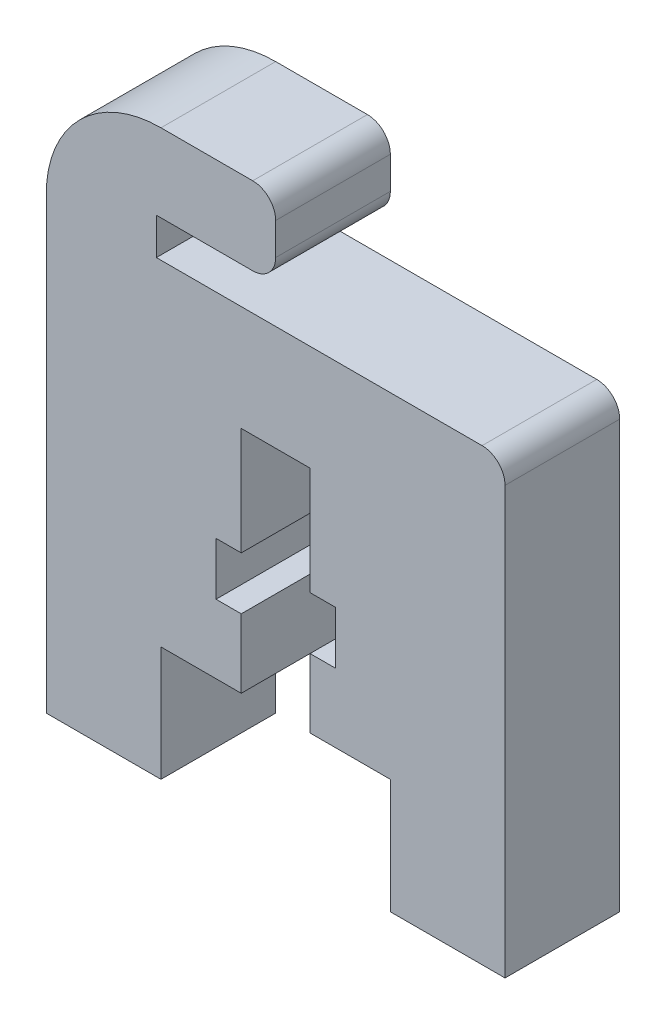
ISO-10303-21;
HEADER;
FILE_DESCRIPTION(('STEP AP214'),'2;1');
FILE_NAME('part.step','',(''),(''),'','','');
FILE_SCHEMA(('AUTOMOTIVE_DESIGN { 1 0 10303 214 1 1 1 1 }'));
ENDSEC;
DATA;
#1=APPLICATION_CONTEXT('core data for automotive mechanical design processes');
#2=APPLICATION_PROTOCOL_DEFINITION('international standard','automotive_design',2000,#1);
#3=PRODUCT_CONTEXT('',#1,'mechanical');
#4=PRODUCT('Part','Part','',(#3));
#5=PRODUCT_RELATED_PRODUCT_CATEGORY('part','',(#4));
#6=PRODUCT_DEFINITION_FORMATION('','',#4);
#7=PRODUCT_DEFINITION_CONTEXT('part definition',#1,'design');
#8=PRODUCT_DEFINITION('design','',#6,#7);
#9=PRODUCT_DEFINITION_SHAPE('','',#8);
#10=(LENGTH_UNIT() NAMED_UNIT(*) SI_UNIT(.MILLI.,.METRE.));
#11=(NAMED_UNIT(*) PLANE_ANGLE_UNIT() SI_UNIT($,.RADIAN.));
#12=(NAMED_UNIT(*) SI_UNIT($,.STERADIAN.) SOLID_ANGLE_UNIT());
#13=UNCERTAINTY_MEASURE_WITH_UNIT(LENGTH_MEASURE(1.E-05),#10,'distance_accuracy_value','');
#14=(GEOMETRIC_REPRESENTATION_CONTEXT(3) GLOBAL_UNCERTAINTY_ASSIGNED_CONTEXT((#13)) GLOBAL_UNIT_ASSIGNED_CONTEXT((#10,
#11,#12)) REPRESENTATION_CONTEXT('',''));
#15=CARTESIAN_POINT('',(0.,0.,0.));
#16=DIRECTION('',(0.,0.,1.));
#17=DIRECTION('',(1.,0.,0.));
#18=AXIS2_PLACEMENT_3D('',#15,#16,#17);
#19=CARTESIAN_POINT('',(5.,0.,5.));
#20=DIRECTION('',(0.,1.,0.));
#21=DIRECTION('',(0.,0.,1.));
#22=AXIS2_PLACEMENT_3D('',#19,#20,#21);
#23=PLANE('',#22);
#24=DIRECTION('',(1.,0.,0.));
#25=VECTOR('',#24,1.);
#26=CARTESIAN_POINT('',(5.,0.,0.));
#27=LINE('',#26,#25);
#28=CARTESIAN_POINT('',(0.,0.,0.));
#29=VERTEX_POINT('',#28);
#30=CARTESIAN_POINT('',(5.,0.,0.));
#31=VERTEX_POINT('',#30);
#32=EDGE_CURVE('E361',#29,#31,#27,.T.);
#33=ORIENTED_EDGE('',*,*,#32,.T.);
#34=DIRECTION('',(0.,0.,-1.));
#35=VECTOR('',#34,1.);
#36=CARTESIAN_POINT('',(5.,0.,5.));
#37=LINE('',#36,#35);
#38=CARTESIAN_POINT('',(5.,0.,5.));
#39=VERTEX_POINT('',#38);
#40=EDGE_CURVE('E234',#39,#31,#37,.T.);
#41=ORIENTED_EDGE('',*,*,#40,.F.);
#42=DIRECTION('',(1.,0.,0.));
#43=VECTOR('',#42,1.);
#44=CARTESIAN_POINT('',(5.,0.,5.));
#45=LINE('',#44,#43);
#46=CARTESIAN_POINT('',(0.,0.,5.));
#47=VERTEX_POINT('',#46);
#48=EDGE_CURVE('E220',#47,#39,#45,.T.);
#49=ORIENTED_EDGE('',*,*,#48,.F.);
#50=DIRECTION('',(0.,0.,-1.));
#51=VECTOR('',#50,1.);
#52=CARTESIAN_POINT('',(0.,0.,5.));
#53=LINE('',#52,#51);
#54=EDGE_CURVE('E232',#47,#29,#53,.T.);
#55=ORIENTED_EDGE('',*,*,#54,.T.);
#56=EDGE_LOOP('',(#33,#41,#49,#55));
#57=FACE_BOUND('',#56,.T.);
#58=ADVANCED_FACE('F33',(#57),#23,.F.);
#59=CARTESIAN_POINT('',(5.,0.,5.));
#60=DIRECTION('',(-1.,0.,0.));
#61=DIRECTION('',(0.,-1.,0.));
#62=AXIS2_PLACEMENT_3D('',#59,#60,#61);
#63=PLANE('',#62);
#64=DIRECTION('',(0.,1.,0.));
#65=VECTOR('',#64,1.);
#66=CARTESIAN_POINT('',(5.,0.,0.));
#67=LINE('',#66,#65);
#68=CARTESIAN_POINT('',(5.,5.,0.));
#69=VERTEX_POINT('',#68);
#70=EDGE_CURVE('E355',#31,#69,#67,.T.);
#71=ORIENTED_EDGE('',*,*,#70,.T.);
#72=DIRECTION('',(0.,0.,-1.));
#73=VECTOR('',#72,1.);
#74=CARTESIAN_POINT('',(5.,5.,5.));
#75=LINE('',#74,#73);
#76=CARTESIAN_POINT('',(5.,5.,5.));
#77=VERTEX_POINT('',#76);
#78=EDGE_CURVE('E245',#77,#69,#75,.T.);
#79=ORIENTED_EDGE('',*,*,#78,.F.);
#80=DIRECTION('',(0.,1.,0.));
#81=VECTOR('',#80,1.);
#82=CARTESIAN_POINT('',(5.,0.,5.));
#83=LINE('',#82,#81);
#84=EDGE_CURVE('E236',#39,#77,#83,.T.);
#85=ORIENTED_EDGE('',*,*,#84,.F.);
#86=ORIENTED_EDGE('',*,*,#40,.T.);
#87=EDGE_LOOP('',(#71,#79,#85,#86));
#88=FACE_BOUND('',#87,.T.);
#89=ADVANCED_FACE('F418',(#88),#63,.F.);
#90=CARTESIAN_POINT('',(8.50000000000001,5.,5.));
#91=DIRECTION('',(0.,1.,0.));
#92=DIRECTION('',(-1.,0.,0.));
#93=AXIS2_PLACEMENT_3D('',#90,#91,#92);
#94=PLANE('',#93);
#95=DIRECTION('',(1.,0.,0.));
#96=VECTOR('',#95,1.);
#97=CARTESIAN_POINT('',(8.50000000000001,5.,0.));
#98=LINE('',#97,#96);
#99=CARTESIAN_POINT('',(8.50000000000001,5.,0.));
#100=VERTEX_POINT('',#99);
#101=EDGE_CURVE('E350',#69,#100,#98,.T.);
#102=ORIENTED_EDGE('',*,*,#101,.T.);
#103=DIRECTION('',(0.,0.,-1.));
#104=VECTOR('',#103,1.);
#105=CARTESIAN_POINT('',(8.50000000000001,5.,5.));
#106=LINE('',#105,#104);
#107=CARTESIAN_POINT('',(8.50000000000001,5.,5.));
#108=VERTEX_POINT('',#107);
#109=EDGE_CURVE('E341',#108,#100,#106,.T.);
#110=ORIENTED_EDGE('',*,*,#109,.F.);
#111=DIRECTION('',(1.,0.,0.));
#112=VECTOR('',#111,1.);
#113=CARTESIAN_POINT('',(8.50000000000001,5.,5.));
#114=LINE('',#113,#112);
#115=EDGE_CURVE('E351',#77,#108,#114,.T.);
#116=ORIENTED_EDGE('',*,*,#115,.F.);
#117=ORIENTED_EDGE('',*,*,#78,.T.);
#118=EDGE_LOOP('',(#102,#110,#116,#117));
#119=FACE_BOUND('',#118,.T.);
#120=ADVANCED_FACE('F348',(#119),#94,.F.);
#121=CARTESIAN_POINT('',(8.5,8.,5.));
#122=DIRECTION('',(-1.,0.,0.));
#123=DIRECTION('',(0.,-1.,0.));
#124=AXIS2_PLACEMENT_3D('',#121,#122,#123);
#125=PLANE('',#124);
#126=DIRECTION('',(0.,1.,0.));
#127=VECTOR('',#126,1.);
#128=CARTESIAN_POINT('',(8.5,8.,0.));
#129=LINE('',#128,#127);
#130=CARTESIAN_POINT('',(8.5,8.,0.));
#131=VERTEX_POINT('',#130);
#132=EDGE_CURVE('E357',#100,#131,#129,.T.);
#133=ORIENTED_EDGE('',*,*,#132,.T.);
#134=DIRECTION('',(0.,0.,-1.));
#135=VECTOR('',#134,1.);
#136=CARTESIAN_POINT('',(8.5,8.,5.));
#137=LINE('',#136,#135);
#138=CARTESIAN_POINT('',(8.5,8.,5.));
#139=VERTEX_POINT('',#138);
#140=EDGE_CURVE('E338',#139,#131,#137,.T.);
#141=ORIENTED_EDGE('',*,*,#140,.F.);
#142=DIRECTION('',(0.,1.,0.));
#143=VECTOR('',#142,1.);
#144=CARTESIAN_POINT('',(8.5,8.,5.));
#145=LINE('',#144,#143);
#146=EDGE_CURVE('E420',#108,#139,#145,.T.);
#147=ORIENTED_EDGE('',*,*,#146,.F.);
#148=ORIENTED_EDGE('',*,*,#109,.T.);
#149=EDGE_LOOP('',(#133,#141,#147,#148));
#150=FACE_BOUND('',#149,.T.);
#151=ADVANCED_FACE('F537',(#150),#125,.F.);
#152=CARTESIAN_POINT('',(8.5,8.,5.));
#153=DIRECTION('',(0.,-1.,0.));
#154=DIRECTION('',(1.,0.,0.));
#155=AXIS2_PLACEMENT_3D('',#152,#153,#154);
#156=PLANE('',#155);
#157=DIRECTION('',(-1.,0.,0.));
#158=VECTOR('',#157,1.);
#159=CARTESIAN_POINT('',(8.5,8.,0.));
#160=LINE('',#159,#158);
#161=CARTESIAN_POINT('',(7.4,8.00000000000001,0.));
#162=VERTEX_POINT('',#161);
#163=EDGE_CURVE('E359',#131,#162,#160,.T.);
#164=ORIENTED_EDGE('',*,*,#163,.T.);
#165=DIRECTION('',(0.,0.,-1.));
#166=VECTOR('',#165,1.);
#167=CARTESIAN_POINT('',(7.4,8.00000000000001,5.));
#168=LINE('',#167,#166);
#169=CARTESIAN_POINT('',(7.4,8.00000000000001,5.));
#170=VERTEX_POINT('',#169);
#171=EDGE_CURVE('E335',#170,#162,#168,.T.);
#172=ORIENTED_EDGE('',*,*,#171,.F.);
#173=DIRECTION('',(-1.,0.,0.));
#174=VECTOR('',#173,1.);
#175=CARTESIAN_POINT('',(8.5,8.,5.));
#176=LINE('',#175,#174);
#177=EDGE_CURVE('E424',#139,#170,#176,.T.);
#178=ORIENTED_EDGE('',*,*,#177,.F.);
#179=ORIENTED_EDGE('',*,*,#140,.T.);
#180=EDGE_LOOP('',(#164,#172,#178,#179));
#181=FACE_BOUND('',#180,.T.);
#182=ADVANCED_FACE('F533',(#181),#156,.F.);
#183=CARTESIAN_POINT('',(7.4,8.00000000000001,5.));
#184=DIRECTION('',(-1.,0.,0.));
#185=DIRECTION('',(0.,-1.,0.));
#186=AXIS2_PLACEMENT_3D('',#183,#184,#185);
#187=PLANE('',#186);
#188=DIRECTION('',(0.,1.,0.));
#189=VECTOR('',#188,1.);
#190=CARTESIAN_POINT('',(7.4,8.00000000000001,0.));
#191=LINE('',#190,#189);
#192=CARTESIAN_POINT('',(7.4,10.3,0.));
#193=VERTEX_POINT('',#192);
#194=EDGE_CURVE('E366',#162,#193,#191,.T.);
#195=ORIENTED_EDGE('',*,*,#194,.T.);
#196=DIRECTION('',(0.,0.,-1.));
#197=VECTOR('',#196,1.);
#198=CARTESIAN_POINT('',(7.4,10.3,5.));
#199=LINE('',#198,#197);
#200=CARTESIAN_POINT('',(7.4,10.3,5.));
#201=VERTEX_POINT('',#200);
#202=EDGE_CURVE('E332',#201,#193,#199,.T.);
#203=ORIENTED_EDGE('',*,*,#202,.F.);
#204=DIRECTION('',(0.,1.,0.));
#205=VECTOR('',#204,1.);
#206=CARTESIAN_POINT('',(7.4,8.00000000000001,5.));
#207=LINE('',#206,#205);
#208=EDGE_CURVE('E426',#170,#201,#207,.T.);
#209=ORIENTED_EDGE('',*,*,#208,.F.);
#210=ORIENTED_EDGE('',*,*,#171,.T.);
#211=EDGE_LOOP('',(#195,#203,#209,#210));
#212=FACE_BOUND('',#211,.T.);
#213=ADVANCED_FACE('F529',(#212),#187,.F.);
#214=CARTESIAN_POINT('',(7.4,10.3,5.));
#215=DIRECTION('',(0.,1.,0.));
#216=DIRECTION('',(-1.,0.,0.));
#217=AXIS2_PLACEMENT_3D('',#214,#215,#216);
#218=PLANE('',#217);
#219=DIRECTION('',(1.,0.,0.));
#220=VECTOR('',#219,1.);
#221=CARTESIAN_POINT('',(7.4,10.3,0.));
#222=LINE('',#221,#220);
#223=CARTESIAN_POINT('',(8.5,10.3,0.));
#224=VERTEX_POINT('',#223);
#225=EDGE_CURVE('E368',#193,#224,#222,.T.);
#226=ORIENTED_EDGE('',*,*,#225,.T.);
#227=DIRECTION('',(0.,0.,-1.));
#228=VECTOR('',#227,1.);
#229=CARTESIAN_POINT('',(8.5,10.3,5.));
#230=LINE('',#229,#228);
#231=CARTESIAN_POINT('',(8.5,10.3,5.));
#232=VERTEX_POINT('',#231);
#233=EDGE_CURVE('E329',#232,#224,#230,.T.);
#234=ORIENTED_EDGE('',*,*,#233,.F.);
#235=DIRECTION('',(1.,0.,0.));
#236=VECTOR('',#235,1.);
#237=CARTESIAN_POINT('',(7.4,10.3,5.));
#238=LINE('',#237,#236);
#239=EDGE_CURVE('E428',#201,#232,#238,.T.);
#240=ORIENTED_EDGE('',*,*,#239,.F.);
#241=ORIENTED_EDGE('',*,*,#202,.T.);
#242=EDGE_LOOP('',(#226,#234,#240,#241));
#243=FACE_BOUND('',#242,.T.);
#244=ADVANCED_FACE('F524',(#243),#218,.F.);
#245=CARTESIAN_POINT('',(8.5,15.,5.));
#246=DIRECTION('',(-1.,0.,0.));
#247=DIRECTION('',(0.,-1.,0.));
#248=AXIS2_PLACEMENT_3D('',#245,#246,#247);
#249=PLANE('',#248);
#250=DIRECTION('',(0.,1.,0.));
#251=VECTOR('',#250,1.);
#252=CARTESIAN_POINT('',(8.5,15.,0.));
#253=LINE('',#252,#251);
#254=CARTESIAN_POINT('',(8.5,15.,0.));
#255=VERTEX_POINT('',#254);
#256=EDGE_CURVE('E370',#224,#255,#253,.T.);
#257=ORIENTED_EDGE('',*,*,#256,.T.);
#258=DIRECTION('',(0.,0.,-1.));
#259=VECTOR('',#258,1.);
#260=CARTESIAN_POINT('',(8.5,15.,5.));
#261=LINE('',#260,#259);
#262=CARTESIAN_POINT('',(8.5,15.,5.));
#263=VERTEX_POINT('',#262);
#264=EDGE_CURVE('E326',#263,#255,#261,.T.);
#265=ORIENTED_EDGE('',*,*,#264,.F.);
#266=DIRECTION('',(0.,1.,0.));
#267=VECTOR('',#266,1.);
#268=CARTESIAN_POINT('',(8.5,15.,5.));
#269=LINE('',#268,#267);
#270=EDGE_CURVE('E430',#232,#263,#269,.T.);
#271=ORIENTED_EDGE('',*,*,#270,.F.);
#272=ORIENTED_EDGE('',*,*,#233,.T.);
#273=EDGE_LOOP('',(#257,#265,#271,#272));
#274=FACE_BOUND('',#273,.T.);
#275=ADVANCED_FACE('F519',(#274),#249,.F.);
#276=CARTESIAN_POINT('',(11.5,15.,5.));
#277=DIRECTION('',(0.,1.,0.));
#278=DIRECTION('',(0.,0.,1.));
#279=AXIS2_PLACEMENT_3D('',#276,#277,#278);
#280=PLANE('',#279);
#281=DIRECTION('',(1.,0.,0.));
#282=VECTOR('',#281,1.);
#283=CARTESIAN_POINT('',(11.5,15.,0.));
#284=LINE('',#283,#282);
#285=CARTESIAN_POINT('',(11.5,15.,0.));
#286=VERTEX_POINT('',#285);
#287=EDGE_CURVE('E372',#255,#286,#284,.T.);
#288=ORIENTED_EDGE('',*,*,#287,.T.);
#289=DIRECTION('',(0.,0.,-1.));
#290=VECTOR('',#289,1.);
#291=CARTESIAN_POINT('',(11.5,15.,5.));
#292=LINE('',#291,#290);
#293=CARTESIAN_POINT('',(11.5,15.,5.));
#294=VERTEX_POINT('',#293);
#295=EDGE_CURVE('E323',#294,#286,#292,.T.);
#296=ORIENTED_EDGE('',*,*,#295,.F.);
#297=DIRECTION('',(1.,0.,0.));
#298=VECTOR('',#297,1.);
#299=CARTESIAN_POINT('',(11.5,15.,5.));
#300=LINE('',#299,#298);
#301=EDGE_CURVE('E432',#263,#294,#300,.T.);
#302=ORIENTED_EDGE('',*,*,#301,.F.);
#303=ORIENTED_EDGE('',*,*,#264,.T.);
#304=EDGE_LOOP('',(#288,#296,#302,#303));
#305=FACE_BOUND('',#304,.T.);
#306=ADVANCED_FACE('F515',(#305),#280,.F.);
#307=CARTESIAN_POINT('',(11.5,10.3,5.));
#308=DIRECTION('',(1.,0.,0.));
#309=DIRECTION('',(0.,0.,-1.));
#310=AXIS2_PLACEMENT_3D('',#307,#308,#309);
#311=PLANE('',#310);
#312=DIRECTION('',(0.,-1.,0.));
#313=VECTOR('',#312,1.);
#314=CARTESIAN_POINT('',(11.5,10.3,0.));
#315=LINE('',#314,#313);
#316=CARTESIAN_POINT('',(11.5,10.3,0.));
#317=VERTEX_POINT('',#316);
#318=EDGE_CURVE('E374',#286,#317,#315,.T.);
#319=ORIENTED_EDGE('',*,*,#318,.T.);
#320=DIRECTION('',(0.,0.,-1.));
#321=VECTOR('',#320,1.);
#322=CARTESIAN_POINT('',(11.5,10.3,5.));
#323=LINE('',#322,#321);
#324=CARTESIAN_POINT('',(11.5,10.3,5.));
#325=VERTEX_POINT('',#324);
#326=EDGE_CURVE('E320',#325,#317,#323,.T.);
#327=ORIENTED_EDGE('',*,*,#326,.F.);
#328=DIRECTION('',(0.,-1.,0.));
#329=VECTOR('',#328,1.);
#330=CARTESIAN_POINT('',(11.5,10.3,5.));
#331=LINE('',#330,#329);
#332=EDGE_CURVE('E434',#294,#325,#331,.T.);
#333=ORIENTED_EDGE('',*,*,#332,.F.);
#334=ORIENTED_EDGE('',*,*,#295,.T.);
#335=EDGE_LOOP('',(#319,#327,#333,#334));
#336=FACE_BOUND('',#335,.T.);
#337=ADVANCED_FACE('F510',(#336),#311,.F.);
#338=CARTESIAN_POINT('',(11.5,10.3,5.));
#339=DIRECTION('',(0.,1.,0.));
#340=DIRECTION('',(-1.,0.,0.));
#341=AXIS2_PLACEMENT_3D('',#338,#339,#340);
#342=PLANE('',#341);
#343=DIRECTION('',(1.,0.,0.));
#344=VECTOR('',#343,1.);
#345=CARTESIAN_POINT('',(11.5,10.3,0.));
#346=LINE('',#345,#344);
#347=CARTESIAN_POINT('',(12.6,10.3,0.));
#348=VERTEX_POINT('',#347);
#349=EDGE_CURVE('E376',#317,#348,#346,.T.);
#350=ORIENTED_EDGE('',*,*,#349,.T.);
#351=DIRECTION('',(0.,0.,-1.));
#352=VECTOR('',#351,1.);
#353=CARTESIAN_POINT('',(12.6,10.3,5.));
#354=LINE('',#353,#352);
#355=CARTESIAN_POINT('',(12.6,10.3,5.));
#356=VERTEX_POINT('',#355);
#357=EDGE_CURVE('E317',#356,#348,#354,.T.);
#358=ORIENTED_EDGE('',*,*,#357,.F.);
#359=DIRECTION('',(1.,0.,0.));
#360=VECTOR('',#359,1.);
#361=CARTESIAN_POINT('',(11.5,10.3,5.));
#362=LINE('',#361,#360);
#363=EDGE_CURVE('E436',#325,#356,#362,.T.);
#364=ORIENTED_EDGE('',*,*,#363,.F.);
#365=ORIENTED_EDGE('',*,*,#326,.T.);
#366=EDGE_LOOP('',(#350,#358,#364,#365));
#367=FACE_BOUND('',#366,.T.);
#368=ADVANCED_FACE('F504',(#367),#342,.F.);
#369=CARTESIAN_POINT('',(12.6,10.3,5.));
#370=DIRECTION('',(1.,0.,0.));
#371=DIRECTION('',(0.,1.,0.));
#372=AXIS2_PLACEMENT_3D('',#369,#370,#371);
#373=PLANE('',#372);
#374=DIRECTION('',(0.,-1.,0.));
#375=VECTOR('',#374,1.);
#376=CARTESIAN_POINT('',(12.6,10.3,0.));
#377=LINE('',#376,#375);
#378=CARTESIAN_POINT('',(12.6,8.,0.));
#379=VERTEX_POINT('',#378);
#380=EDGE_CURVE('E378',#348,#379,#377,.T.);
#381=ORIENTED_EDGE('',*,*,#380,.T.);
#382=DIRECTION('',(0.,0.,-1.));
#383=VECTOR('',#382,1.);
#384=CARTESIAN_POINT('',(12.6,8.,5.));
#385=LINE('',#384,#383);
#386=CARTESIAN_POINT('',(12.6,8.,5.));
#387=VERTEX_POINT('',#386);
#388=EDGE_CURVE('E314',#387,#379,#385,.T.);
#389=ORIENTED_EDGE('',*,*,#388,.F.);
#390=DIRECTION('',(0.,-1.,0.));
#391=VECTOR('',#390,1.);
#392=CARTESIAN_POINT('',(12.6,10.3,5.));
#393=LINE('',#392,#391);
#394=EDGE_CURVE('E438',#356,#387,#393,.T.);
#395=ORIENTED_EDGE('',*,*,#394,.F.);
#396=ORIENTED_EDGE('',*,*,#357,.T.);
#397=EDGE_LOOP('',(#381,#389,#395,#396));
#398=FACE_BOUND('',#397,.T.);
#399=ADVANCED_FACE('F500',(#398),#373,.F.);
#400=CARTESIAN_POINT('',(12.6,8.,5.));
#401=DIRECTION('',(0.,-1.,0.));
#402=DIRECTION('',(0.,0.,-1.));
#403=AXIS2_PLACEMENT_3D('',#400,#401,#402);
#404=PLANE('',#403);
#405=DIRECTION('',(-1.,0.,0.));
#406=VECTOR('',#405,1.);
#407=CARTESIAN_POINT('',(12.6,8.,0.));
#408=LINE('',#407,#406);
#409=CARTESIAN_POINT('',(11.5,8.,0.));
#410=VERTEX_POINT('',#409);
#411=EDGE_CURVE('E380',#379,#410,#408,.T.);
#412=ORIENTED_EDGE('',*,*,#411,.T.);
#413=DIRECTION('',(0.,0.,-1.));
#414=VECTOR('',#413,1.);
#415=CARTESIAN_POINT('',(11.5,8.,5.));
#416=LINE('',#415,#414);
#417=CARTESIAN_POINT('',(11.5,8.,5.));
#418=VERTEX_POINT('',#417);
#419=EDGE_CURVE('E311',#418,#410,#416,.T.);
#420=ORIENTED_EDGE('',*,*,#419,.F.);
#421=DIRECTION('',(-1.,0.,0.));
#422=VECTOR('',#421,1.);
#423=CARTESIAN_POINT('',(12.6,8.,5.));
#424=LINE('',#423,#422);
#425=EDGE_CURVE('E440',#387,#418,#424,.T.);
#426=ORIENTED_EDGE('',*,*,#425,.F.);
#427=ORIENTED_EDGE('',*,*,#388,.T.);
#428=EDGE_LOOP('',(#412,#420,#426,#427));
#429=FACE_BOUND('',#428,.T.);
#430=ADVANCED_FACE('F495',(#429),#404,.F.);
#431=CARTESIAN_POINT('',(11.5,5.,5.));
#432=DIRECTION('',(1.,0.,0.));
#433=DIRECTION('',(0.,1.,0.));
#434=AXIS2_PLACEMENT_3D('',#431,#432,#433);
#435=PLANE('',#434);
#436=DIRECTION('',(0.,-1.,0.));
#437=VECTOR('',#436,1.);
#438=CARTESIAN_POINT('',(11.5,5.,0.));
#439=LINE('',#438,#437);
#440=CARTESIAN_POINT('',(11.5,5.,0.));
#441=VERTEX_POINT('',#440);
#442=EDGE_CURVE('E382',#410,#441,#439,.T.);
#443=ORIENTED_EDGE('',*,*,#442,.T.);
#444=DIRECTION('',(0.,0.,-1.));
#445=VECTOR('',#444,1.);
#446=CARTESIAN_POINT('',(11.5,5.,5.));
#447=LINE('',#446,#445);
#448=CARTESIAN_POINT('',(11.5,5.,5.));
#449=VERTEX_POINT('',#448);
#450=EDGE_CURVE('E308',#449,#441,#447,.T.);
#451=ORIENTED_EDGE('',*,*,#450,.F.);
#452=DIRECTION('',(0.,-1.,0.));
#453=VECTOR('',#452,1.);
#454=CARTESIAN_POINT('',(11.5,5.,5.));
#455=LINE('',#454,#453);
#456=EDGE_CURVE('E442',#418,#449,#455,.T.);
#457=ORIENTED_EDGE('',*,*,#456,.F.);
#458=ORIENTED_EDGE('',*,*,#419,.T.);
#459=EDGE_LOOP('',(#443,#451,#457,#458));
#460=FACE_BOUND('',#459,.T.);
#461=ADVANCED_FACE('F489',(#460),#435,.F.);
#462=CARTESIAN_POINT('',(11.5,5.,5.));
#463=DIRECTION('',(0.,1.,0.));
#464=DIRECTION('',(0.,0.,1.));
#465=AXIS2_PLACEMENT_3D('',#462,#463,#464);
#466=PLANE('',#465);
#467=DIRECTION('',(1.,0.,0.));
#468=VECTOR('',#467,1.);
#469=CARTESIAN_POINT('',(11.5,5.,0.));
#470=LINE('',#469,#468);
#471=CARTESIAN_POINT('',(15.,5.,0.));
#472=VERTEX_POINT('',#471);
#473=EDGE_CURVE('E384',#441,#472,#470,.T.);
#474=ORIENTED_EDGE('',*,*,#473,.T.);
#475=DIRECTION('',(0.,0.,-1.));
#476=VECTOR('',#475,1.);
#477=CARTESIAN_POINT('',(15.,5.,5.));
#478=LINE('',#477,#476);
#479=CARTESIAN_POINT('',(15.,5.,5.));
#480=VERTEX_POINT('',#479);
#481=EDGE_CURVE('E305',#480,#472,#478,.T.);
#482=ORIENTED_EDGE('',*,*,#481,.F.);
#483=DIRECTION('',(1.,0.,0.));
#484=VECTOR('',#483,1.);
#485=CARTESIAN_POINT('',(11.5,5.,5.));
#486=LINE('',#485,#484);
#487=EDGE_CURVE('E444',#449,#480,#486,.T.);
#488=ORIENTED_EDGE('',*,*,#487,.F.);
#489=ORIENTED_EDGE('',*,*,#450,.T.);
#490=EDGE_LOOP('',(#474,#482,#488,#489));
#491=FACE_BOUND('',#490,.T.);
#492=ADVANCED_FACE('F485',(#491),#466,.F.);
#493=CARTESIAN_POINT('',(15.,5.,5.));
#494=DIRECTION('',(1.,0.,0.));
#495=DIRECTION('',(0.,0.,-1.));
#496=AXIS2_PLACEMENT_3D('',#493,#494,#495);
#497=PLANE('',#496);
#498=DIRECTION('',(0.,-1.,0.));
#499=VECTOR('',#498,1.);
#500=CARTESIAN_POINT('',(15.,5.,0.));
#501=LINE('',#500,#499);
#502=CARTESIAN_POINT('',(15.,0.,0.));
#503=VERTEX_POINT('',#502);
#504=EDGE_CURVE('E386',#472,#503,#501,.T.);
#505=ORIENTED_EDGE('',*,*,#504,.T.);
#506=DIRECTION('',(0.,0.,-1.));
#507=VECTOR('',#506,1.);
#508=CARTESIAN_POINT('',(15.,0.,5.));
#509=LINE('',#508,#507);
#510=CARTESIAN_POINT('',(15.,0.,5.));
#511=VERTEX_POINT('',#510);
#512=EDGE_CURVE('E302',#511,#503,#509,.T.);
#513=ORIENTED_EDGE('',*,*,#512,.F.);
#514=DIRECTION('',(0.,-1.,0.));
#515=VECTOR('',#514,1.);
#516=CARTESIAN_POINT('',(15.,5.,5.));
#517=LINE('',#516,#515);
#518=EDGE_CURVE('E446',#480,#511,#517,.T.);
#519=ORIENTED_EDGE('',*,*,#518,.F.);
#520=ORIENTED_EDGE('',*,*,#481,.T.);
#521=EDGE_LOOP('',(#505,#513,#519,#520));
#522=FACE_BOUND('',#521,.T.);
#523=ADVANCED_FACE('F481',(#522),#497,.F.);
#524=CARTESIAN_POINT('',(15.,0.,5.));
#525=DIRECTION('',(0.,1.,0.));
#526=DIRECTION('',(0.,0.,1.));
#527=AXIS2_PLACEMENT_3D('',#524,#525,#526);
#528=PLANE('',#527);
#529=DIRECTION('',(1.,0.,0.));
#530=VECTOR('',#529,1.);
#531=CARTESIAN_POINT('',(15.,0.,0.));
#532=LINE('',#531,#530);
#533=CARTESIAN_POINT('',(20.,0.,0.));
#534=VERTEX_POINT('',#533);
#535=EDGE_CURVE('E388',#503,#534,#532,.T.);
#536=ORIENTED_EDGE('',*,*,#535,.T.);
#537=DIRECTION('',(0.,0.,-1.));
#538=VECTOR('',#537,1.);
#539=CARTESIAN_POINT('',(20.,0.,5.));
#540=LINE('',#539,#538);
#541=CARTESIAN_POINT('',(20.,0.,5.));
#542=VERTEX_POINT('',#541);
#543=EDGE_CURVE('E299',#542,#534,#540,.T.);
#544=ORIENTED_EDGE('',*,*,#543,.F.);
#545=DIRECTION('',(1.,0.,0.));
#546=VECTOR('',#545,1.);
#547=CARTESIAN_POINT('',(15.,0.,5.));
#548=LINE('',#547,#546);
#549=EDGE_CURVE('E448',#511,#542,#548,.T.);
#550=ORIENTED_EDGE('',*,*,#549,.F.);
#551=ORIENTED_EDGE('',*,*,#512,.T.);
#552=EDGE_LOOP('',(#536,#544,#550,#551));
#553=FACE_BOUND('',#552,.T.);
#554=ADVANCED_FACE('F475',(#553),#528,.F.);
#555=CARTESIAN_POINT('',(20.,5.,5.));
#556=DIRECTION('',(-1.,0.,0.));
#557=DIRECTION('',(0.,0.,1.));
#558=AXIS2_PLACEMENT_3D('',#555,#556,#557);
#559=PLANE('',#558);
#560=DIRECTION('',(0.,1.,0.));
#561=VECTOR('',#560,1.);
#562=CARTESIAN_POINT('',(20.,5.,0.));
#563=LINE('',#562,#561);
#564=CARTESIAN_POINT('',(20.,18.6,0.));
#565=VERTEX_POINT('',#564);
#566=EDGE_CURVE('E391',#534,#565,#563,.T.);
#567=ORIENTED_EDGE('',*,*,#566,.T.);
#568=DIRECTION('',(0.,0.,-1.));
#569=VECTOR('',#568,1.);
#570=CARTESIAN_POINT('',(20.,18.6,5.));
#571=LINE('',#570,#569);
#572=CARTESIAN_POINT('',(20.,18.6,5.));
#573=VERTEX_POINT('',#572);
#574=EDGE_CURVE('E262',#565,#573,#571,.F.);
#575=ORIENTED_EDGE('',*,*,#574,.T.);
#576=DIRECTION('',(0.,1.,0.));
#577=VECTOR('',#576,1.);
#578=CARTESIAN_POINT('',(20.,0.,5.));
#579=LINE('',#578,#577);
#580=EDGE_CURVE('E450',#542,#573,#579,.T.);
#581=ORIENTED_EDGE('',*,*,#580,.F.);
#582=ORIENTED_EDGE('',*,*,#543,.T.);
#583=EDGE_LOOP('',(#567,#575,#581,#582));
#584=FACE_BOUND('',#583,.T.);
#585=ADVANCED_FACE('F469',(#584),#559,.F.);
#586=CARTESIAN_POINT('',(20.,19.6,5.));
#587=DIRECTION('',(0.,-1.,0.));
#588=DIRECTION('',(1.,0.,0.));
#589=AXIS2_PLACEMENT_3D('',#586,#587,#588);
#590=PLANE('',#589);
#591=DIRECTION('',(-1.,0.,0.));
#592=VECTOR('',#591,1.);
#593=CARTESIAN_POINT('',(20.,19.6,5.));
#594=LINE('',#593,#592);
#595=CARTESIAN_POINT('',(19.,19.6,5.));
#596=VERTEX_POINT('',#595);
#597=CARTESIAN_POINT('',(4.8,19.6,5.));
#598=VERTEX_POINT('',#597);
#599=EDGE_CURVE('E453',#596,#598,#594,.T.);
#600=ORIENTED_EDGE('',*,*,#599,.F.);
#601=DIRECTION('',(0.,0.,-1.));
#602=VECTOR('',#601,1.);
#603=CARTESIAN_POINT('',(19.,19.6,5.));
#604=LINE('',#603,#602);
#605=CARTESIAN_POINT('',(19.,19.6,0.));
#606=VERTEX_POINT('',#605);
#607=EDGE_CURVE('E255',#596,#606,#604,.T.);
#608=ORIENTED_EDGE('',*,*,#607,.T.);
#609=DIRECTION('',(-1.,0.,0.));
#610=VECTOR('',#609,1.);
#611=CARTESIAN_POINT('',(20.,19.6,0.));
#612=LINE('',#611,#610);
#613=CARTESIAN_POINT('',(4.8,19.6,0.));
#614=VERTEX_POINT('',#613);
#615=EDGE_CURVE('E394',#606,#614,#612,.T.);
#616=ORIENTED_EDGE('',*,*,#615,.T.);
#617=DIRECTION('',(0.,0.,-1.));
#618=VECTOR('',#617,1.);
#619=CARTESIAN_POINT('',(4.8,19.6,5.));
#620=LINE('',#619,#618);
#621=EDGE_CURVE('E296',#598,#614,#620,.T.);
#622=ORIENTED_EDGE('',*,*,#621,.F.);
#623=EDGE_LOOP('',(#600,#608,#616,#622));
#624=FACE_BOUND('',#623,.T.);
#625=ADVANCED_FACE('F461',(#624),#590,.F.);
#626=CARTESIAN_POINT('',(4.8,19.6,5.));
#627=DIRECTION('',(-1.,0.,0.));
#628=DIRECTION('',(0.,0.,1.));
#629=AXIS2_PLACEMENT_3D('',#626,#627,#628);
#630=PLANE('',#629);
#631=DIRECTION('',(0.,1.,0.));
#632=VECTOR('',#631,1.);
#633=CARTESIAN_POINT('',(4.8,19.6,0.));
#634=LINE('',#633,#632);
#635=CARTESIAN_POINT('',(4.8,21.2,0.));
#636=VERTEX_POINT('',#635);
#637=EDGE_CURVE('E396',#614,#636,#634,.T.);
#638=ORIENTED_EDGE('',*,*,#637,.T.);
#639=DIRECTION('',(0.,0.,-1.));
#640=VECTOR('',#639,1.);
#641=CARTESIAN_POINT('',(4.8,21.2,5.));
#642=LINE('',#641,#640);
#643=CARTESIAN_POINT('',(4.8,21.2,5.));
#644=VERTEX_POINT('',#643);
#645=EDGE_CURVE('E293',#644,#636,#642,.T.);
#646=ORIENTED_EDGE('',*,*,#645,.F.);
#647=DIRECTION('',(0.,1.,0.));
#648=VECTOR('',#647,1.);
#649=CARTESIAN_POINT('',(4.8,19.6,5.));
#650=LINE('',#649,#648);
#651=EDGE_CURVE('E415',#598,#644,#650,.T.);
#652=ORIENTED_EDGE('',*,*,#651,.F.);
#653=ORIENTED_EDGE('',*,*,#621,.T.);
#654=EDGE_LOOP('',(#638,#646,#652,#653));
#655=FACE_BOUND('',#654,.T.);
#656=ADVANCED_FACE('F458',(#655),#630,.F.);
#657=CARTESIAN_POINT('',(4.8,21.2,5.));
#658=DIRECTION('',(0.,1.,0.));
#659=DIRECTION('',(-1.,0.,0.));
#660=AXIS2_PLACEMENT_3D('',#657,#658,#659);
#661=PLANE('',#660);
#662=DIRECTION('',(1.,0.,0.));
#663=VECTOR('',#662,1.);
#664=CARTESIAN_POINT('',(4.8,21.2,0.));
#665=LINE('',#664,#663);
#666=CARTESIAN_POINT('',(9.,21.2,0.));
#667=VERTEX_POINT('',#666);
#668=EDGE_CURVE('E289',#636,#667,#665,.T.);
#669=ORIENTED_EDGE('',*,*,#668,.T.);
#670=DIRECTION('',(0.,0.,-1.));
#671=VECTOR('',#670,1.);
#672=CARTESIAN_POINT('',(9.,21.2,5.));
#673=LINE('',#672,#671);
#674=CARTESIAN_POINT('',(9.,21.2,5.));
#675=VERTEX_POINT('',#674);
#676=EDGE_CURVE('E271',#667,#675,#673,.F.);
#677=ORIENTED_EDGE('',*,*,#676,.T.);
#678=DIRECTION('',(1.,0.,0.));
#679=VECTOR('',#678,1.);
#680=CARTESIAN_POINT('',(4.8,21.2,5.));
#681=LINE('',#680,#679);
#682=EDGE_CURVE('E411',#644,#675,#681,.T.);
#683=ORIENTED_EDGE('',*,*,#682,.F.);
#684=ORIENTED_EDGE('',*,*,#645,.T.);
#685=EDGE_LOOP('',(#669,#677,#683,#684));
#686=FACE_BOUND('',#685,.T.);
#687=ADVANCED_FACE('F401',(#686),#661,.F.);
#688=CARTESIAN_POINT('',(10.,21.2,5.));
#689=DIRECTION('',(-1.,0.,0.));
#690=DIRECTION('',(0.,0.,1.));
#691=AXIS2_PLACEMENT_3D('',#688,#689,#690);
#692=PLANE('',#691);
#693=DIRECTION('',(0.,1.,0.));
#694=VECTOR('',#693,1.);
#695=CARTESIAN_POINT('',(10.,21.2,0.));
#696=LINE('',#695,#694);
#697=CARTESIAN_POINT('',(10.,22.2,0.));
#698=VERTEX_POINT('',#697);
#699=CARTESIAN_POINT('',(10.,23.6,0.));
#700=VERTEX_POINT('',#699);
#701=EDGE_CURVE('E286',#698,#700,#696,.T.);
#702=ORIENTED_EDGE('',*,*,#701,.T.);
#703=DIRECTION('',(0.,0.,-1.));
#704=VECTOR('',#703,1.);
#705=CARTESIAN_POINT('',(10.,23.6,5.));
#706=LINE('',#705,#704);
#707=CARTESIAN_POINT('',(10.,23.6,5.));
#708=VERTEX_POINT('',#707);
#709=EDGE_CURVE('E41',#700,#708,#706,.F.);
#710=ORIENTED_EDGE('',*,*,#709,.T.);
#711=DIRECTION('',(0.,1.,0.));
#712=VECTOR('',#711,1.);
#713=CARTESIAN_POINT('',(10.,21.2,5.));
#714=LINE('',#713,#712);
#715=CARTESIAN_POINT('',(10.,22.2,5.));
#716=VERTEX_POINT('',#715);
#717=EDGE_CURVE('E410',#716,#708,#714,.T.);
#718=ORIENTED_EDGE('',*,*,#717,.F.);
#719=DIRECTION('',(0.,0.,-1.));
#720=VECTOR('',#719,1.);
#721=CARTESIAN_POINT('',(10.,22.2,5.));
#722=LINE('',#721,#720);
#723=EDGE_CURVE('E268',#716,#698,#722,.T.);
#724=ORIENTED_EDGE('',*,*,#723,.T.);
#725=EDGE_LOOP('',(#702,#710,#718,#724));
#726=FACE_BOUND('',#725,.T.);
#727=ADVANCED_FACE('F412',(#726),#692,.F.);
#728=CARTESIAN_POINT('',(10.,24.6,5.));
#729=DIRECTION('',(0.,-1.,0.));
#730=DIRECTION('',(0.,0.,-1.));
#731=AXIS2_PLACEMENT_3D('',#728,#729,#730);
#732=PLANE('',#731);
#733=DIRECTION('',(-1.,0.,0.));
#734=VECTOR('',#733,1.);
#735=CARTESIAN_POINT('',(10.,24.6,5.));
#736=LINE('',#735,#734);
#737=CARTESIAN_POINT('',(9.,24.6,5.));
#738=VERTEX_POINT('',#737);
#739=CARTESIAN_POINT('',(5.,24.6,5.));
#740=VERTEX_POINT('',#739);
#741=EDGE_CURVE('E281',#738,#740,#736,.T.);
#742=ORIENTED_EDGE('',*,*,#741,.F.);
#743=DIRECTION('',(0.,0.,-1.));
#744=VECTOR('',#743,1.);
#745=CARTESIAN_POINT('',(9.,24.6,5.));
#746=LINE('',#745,#744);
#747=CARTESIAN_POINT('',(9.,24.6,0.));
#748=VERTEX_POINT('',#747);
#749=EDGE_CURVE('E273',#738,#748,#746,.T.);
#750=ORIENTED_EDGE('',*,*,#749,.T.);
#751=DIRECTION('',(-1.,0.,0.));
#752=VECTOR('',#751,1.);
#753=CARTESIAN_POINT('',(10.,24.6,0.));
#754=LINE('',#753,#752);
#755=CARTESIAN_POINT('',(5.,24.6,0.));
#756=VERTEX_POINT('',#755);
#757=EDGE_CURVE('E280',#748,#756,#754,.T.);
#758=ORIENTED_EDGE('',*,*,#757,.T.);
#759=DIRECTION('',(0.,0.,-1.));
#760=VECTOR('',#759,1.);
#761=CARTESIAN_POINT('',(5.,24.6,5.));
#762=LINE('',#761,#760);
#763=EDGE_CURVE('E251',#756,#740,#762,.F.);
#764=ORIENTED_EDGE('',*,*,#763,.T.);
#765=EDGE_LOOP('',(#742,#750,#758,#764));
#766=FACE_BOUND('',#765,.T.);
#767=ADVANCED_FACE('F279',(#766),#732,.F.);
#768=CARTESIAN_POINT('',(0.,5.,5.));
#769=DIRECTION('',(1.,0.,0.));
#770=DIRECTION('',(0.,1.,0.));
#771=AXIS2_PLACEMENT_3D('',#768,#769,#770);
#772=PLANE('',#771);
#773=DIRECTION('',(0.,-1.,0.));
#774=VECTOR('',#773,1.);
#775=CARTESIAN_POINT('',(0.,0.,5.));
#776=LINE('',#775,#774);
#777=CARTESIAN_POINT('',(0.,19.6,5.));
#778=VERTEX_POINT('',#777);
#779=EDGE_CURVE('E217',#778,#47,#776,.T.);
#780=ORIENTED_EDGE('',*,*,#779,.F.);
#781=DIRECTION('',(0.,0.,-1.));
#782=VECTOR('',#781,1.);
#783=CARTESIAN_POINT('',(0.,19.6,5.));
#784=LINE('',#783,#782);
#785=CARTESIAN_POINT('',(0.,19.6,0.));
#786=VERTEX_POINT('',#785);
#787=EDGE_CURVE('E241',#778,#786,#784,.T.);
#788=ORIENTED_EDGE('',*,*,#787,.T.);
#789=DIRECTION('',(0.,-1.,0.));
#790=VECTOR('',#789,1.);
#791=CARTESIAN_POINT('',(0.,5.,0.));
#792=LINE('',#791,#790);
#793=EDGE_CURVE('E228',#786,#29,#792,.T.);
#794=ORIENTED_EDGE('',*,*,#793,.T.);
#795=ORIENTED_EDGE('',*,*,#54,.F.);
#796=EDGE_LOOP('',(#780,#788,#794,#795));
#797=FACE_BOUND('',#796,.T.);
#798=ADVANCED_FACE('F238',(#797),#772,.F.);
#799=CARTESIAN_POINT('',(0.,0.,5.));
#800=DIRECTION('',(0.,0.,1.));
#801=DIRECTION('',(1.,0.,0.));
#802=AXIS2_PLACEMENT_3D('',#799,#800,#801);
#803=PLANE('',#802);
#804=ORIENTED_EDGE('',*,*,#717,.T.);
#805=CARTESIAN_POINT('',(9.,23.6,5.));
#806=DIRECTION('',(0.,0.,1.));
#807=DIRECTION('',(1.,0.,0.));
#808=AXIS2_PLACEMENT_3D('',#805,#806,#807);
#809=CIRCLE('',#808,1.);
#810=EDGE_CURVE('E11',#708,#738,#809,.T.);
#811=ORIENTED_EDGE('',*,*,#810,.T.);
#812=ORIENTED_EDGE('',*,*,#741,.T.);
#813=CARTESIAN_POINT('',(5.,19.6,5.));
#814=DIRECTION('',(0.,0.,1.));
#815=DIRECTION('',(1.,0.,0.));
#816=AXIS2_PLACEMENT_3D('',#813,#814,#815);
#817=CIRCLE('',#816,5.);
#818=EDGE_CURVE('E223',#740,#778,#817,.T.);
#819=ORIENTED_EDGE('',*,*,#818,.T.);
#820=ORIENTED_EDGE('',*,*,#779,.T.);
#821=ORIENTED_EDGE('',*,*,#48,.T.);
#822=ORIENTED_EDGE('',*,*,#84,.T.);
#823=ORIENTED_EDGE('',*,*,#115,.T.);
#824=ORIENTED_EDGE('',*,*,#146,.T.);
#825=ORIENTED_EDGE('',*,*,#177,.T.);
#826=ORIENTED_EDGE('',*,*,#208,.T.);
#827=ORIENTED_EDGE('',*,*,#239,.T.);
#828=ORIENTED_EDGE('',*,*,#270,.T.);
#829=ORIENTED_EDGE('',*,*,#301,.T.);
#830=ORIENTED_EDGE('',*,*,#332,.T.);
#831=ORIENTED_EDGE('',*,*,#363,.T.);
#832=ORIENTED_EDGE('',*,*,#394,.T.);
#833=ORIENTED_EDGE('',*,*,#425,.T.);
#834=ORIENTED_EDGE('',*,*,#456,.T.);
#835=ORIENTED_EDGE('',*,*,#487,.T.);
#836=ORIENTED_EDGE('',*,*,#518,.T.);
#837=ORIENTED_EDGE('',*,*,#549,.T.);
#838=ORIENTED_EDGE('',*,*,#580,.T.);
#839=CARTESIAN_POINT('',(19.,18.6,5.));
#840=DIRECTION('',(0.,0.,1.));
#841=DIRECTION('',(1.,0.,0.));
#842=AXIS2_PLACEMENT_3D('',#839,#840,#841);
#843=CIRCLE('',#842,1.);
#844=EDGE_CURVE('E266',#573,#596,#843,.T.);
#845=ORIENTED_EDGE('',*,*,#844,.T.);
#846=ORIENTED_EDGE('',*,*,#599,.T.);
#847=ORIENTED_EDGE('',*,*,#651,.T.);
#848=ORIENTED_EDGE('',*,*,#682,.T.);
#849=CARTESIAN_POINT('',(9.,22.2,5.));
#850=DIRECTION('',(0.,0.,1.));
#851=DIRECTION('',(1.,0.,0.));
#852=AXIS2_PLACEMENT_3D('',#849,#850,#851);
#853=CIRCLE('',#852,1.);
#854=EDGE_CURVE('E264',#675,#716,#853,.T.);
#855=ORIENTED_EDGE('',*,*,#854,.T.);
#856=EDGE_LOOP('',(#804,#811,#812,#819,#820,#821,#822,#823,#824,#825,#826,#827,#828,#829,#830,
#831,#832,#833,#834,#835,#836,#837,#838,#845,#846,#847,#848,#855));
#857=FACE_BOUND('',#856,.T.);
#858=ADVANCED_FACE('F219',(#857),#803,.T.);
#859=CARTESIAN_POINT('',(0.,0.,0.));
#860=DIRECTION('',(0.,0.,1.));
#861=DIRECTION('',(1.,0.,0.));
#862=AXIS2_PLACEMENT_3D('',#859,#860,#861);
#863=PLANE('',#862);
#864=ORIENTED_EDGE('',*,*,#757,.F.);
#865=CARTESIAN_POINT('',(9.,23.6,0.));
#866=DIRECTION('',(0.,0.,1.));
#867=DIRECTION('',(1.,0.,0.));
#868=AXIS2_PLACEMENT_3D('',#865,#866,#867);
#869=CIRCLE('',#868,1.);
#870=EDGE_CURVE('E55',#748,#700,#869,.F.);
#871=ORIENTED_EDGE('',*,*,#870,.T.);
#872=ORIENTED_EDGE('',*,*,#701,.F.);
#873=CARTESIAN_POINT('',(9.,22.2,0.));
#874=DIRECTION('',(0.,0.,1.));
#875=DIRECTION('',(1.,0.,0.));
#876=AXIS2_PLACEMENT_3D('',#873,#874,#875);
#877=CIRCLE('',#876,1.);
#878=EDGE_CURVE('E258',#698,#667,#877,.F.);
#879=ORIENTED_EDGE('',*,*,#878,.T.);
#880=ORIENTED_EDGE('',*,*,#668,.F.);
#881=ORIENTED_EDGE('',*,*,#637,.F.);
#882=ORIENTED_EDGE('',*,*,#615,.F.);
#883=CARTESIAN_POINT('',(19.,18.6,0.));
#884=DIRECTION('',(0.,0.,1.));
#885=DIRECTION('',(1.,0.,0.));
#886=AXIS2_PLACEMENT_3D('',#883,#884,#885);
#887=CIRCLE('',#886,1.);
#888=EDGE_CURVE('E260',#606,#565,#887,.F.);
#889=ORIENTED_EDGE('',*,*,#888,.T.);
#890=ORIENTED_EDGE('',*,*,#566,.F.);
#891=ORIENTED_EDGE('',*,*,#535,.F.);
#892=ORIENTED_EDGE('',*,*,#504,.F.);
#893=ORIENTED_EDGE('',*,*,#473,.F.);
#894=ORIENTED_EDGE('',*,*,#442,.F.);
#895=ORIENTED_EDGE('',*,*,#411,.F.);
#896=ORIENTED_EDGE('',*,*,#380,.F.);
#897=ORIENTED_EDGE('',*,*,#349,.F.);
#898=ORIENTED_EDGE('',*,*,#318,.F.);
#899=ORIENTED_EDGE('',*,*,#287,.F.);
#900=ORIENTED_EDGE('',*,*,#256,.F.);
#901=ORIENTED_EDGE('',*,*,#225,.F.);
#902=ORIENTED_EDGE('',*,*,#194,.F.);
#903=ORIENTED_EDGE('',*,*,#163,.F.);
#904=ORIENTED_EDGE('',*,*,#132,.F.);
#905=ORIENTED_EDGE('',*,*,#101,.F.);
#906=ORIENTED_EDGE('',*,*,#70,.F.);
#907=ORIENTED_EDGE('',*,*,#32,.F.);
#908=ORIENTED_EDGE('',*,*,#793,.F.);
#909=CARTESIAN_POINT('',(5.,19.6,0.));
#910=DIRECTION('',(0.,0.,1.));
#911=DIRECTION('',(1.,0.,0.));
#912=AXIS2_PLACEMENT_3D('',#909,#910,#911);
#913=CIRCLE('',#912,5.);
#914=EDGE_CURVE('E243',#786,#756,#913,.F.);
#915=ORIENTED_EDGE('',*,*,#914,.T.);
#916=EDGE_LOOP('',(#864,#871,#872,#879,#880,#881,#882,#889,#890,#891,#892,#893,#894,#895,#896,
#897,#898,#899,#900,#901,#902,#903,#904,#905,#906,#907,#908,#915));
#917=FACE_BOUND('',#916,.T.);
#918=ADVANCED_FACE('F284',(#917),#863,.F.);
#919=CARTESIAN_POINT('',(5.,19.6,5.));
#920=DIRECTION('',(0.,0.,-1.));
#921=DIRECTION('',(-1.,0.,0.));
#922=AXIS2_PLACEMENT_3D('',#919,#920,#921);
#923=CYLINDRICAL_SURFACE('',#922,5.);
#924=ORIENTED_EDGE('',*,*,#818,.F.);
#925=ORIENTED_EDGE('',*,*,#763,.F.);
#926=ORIENTED_EDGE('',*,*,#914,.F.);
#927=ORIENTED_EDGE('',*,*,#787,.F.);
#928=EDGE_LOOP('',(#924,#925,#926,#927));
#929=FACE_BOUND('',#928,.T.);
#930=ADVANCED_FACE('F553',(#929),#923,.T.);
#931=CARTESIAN_POINT('',(19.,18.6,5.));
#932=DIRECTION('',(0.,0.,-1.));
#933=DIRECTION('',(-1.,0.,0.));
#934=AXIS2_PLACEMENT_3D('',#931,#932,#933);
#935=CYLINDRICAL_SURFACE('',#934,1.);
#936=ORIENTED_EDGE('',*,*,#844,.F.);
#937=ORIENTED_EDGE('',*,*,#574,.F.);
#938=ORIENTED_EDGE('',*,*,#888,.F.);
#939=ORIENTED_EDGE('',*,*,#607,.F.);
#940=EDGE_LOOP('',(#936,#937,#938,#939));
#941=FACE_BOUND('',#940,.T.);
#942=ADVANCED_FACE('F465',(#941),#935,.T.);
#943=CARTESIAN_POINT('',(9.,22.2,5.));
#944=DIRECTION('',(0.,0.,-1.));
#945=DIRECTION('',(-1.,0.,0.));
#946=AXIS2_PLACEMENT_3D('',#943,#944,#945);
#947=CYLINDRICAL_SURFACE('',#946,1.);
#948=ORIENTED_EDGE('',*,*,#854,.F.);
#949=ORIENTED_EDGE('',*,*,#676,.F.);
#950=ORIENTED_EDGE('',*,*,#878,.F.);
#951=ORIENTED_EDGE('',*,*,#723,.F.);
#952=EDGE_LOOP('',(#948,#949,#950,#951));
#953=FACE_BOUND('',#952,.T.);
#954=ADVANCED_FACE('F408',(#953),#947,.T.);
#955=CARTESIAN_POINT('',(9.,23.6,5.));
#956=DIRECTION('',(0.,0.,-1.));
#957=DIRECTION('',(-1.,0.,0.));
#958=AXIS2_PLACEMENT_3D('',#955,#956,#957);
#959=CYLINDRICAL_SURFACE('',#958,1.);
#960=ORIENTED_EDGE('',*,*,#810,.F.);
#961=ORIENTED_EDGE('',*,*,#709,.F.);
#962=ORIENTED_EDGE('',*,*,#870,.F.);
#963=ORIENTED_EDGE('',*,*,#749,.F.);
#964=EDGE_LOOP('',(#960,#961,#962,#963));
#965=FACE_BOUND('',#964,.T.);
#966=ADVANCED_FACE('F35',(#965),#959,.T.);
#967=CLOSED_SHELL('',(#58,#89,#120,#151,#182,#213,#244,#275,#306,#337,#368,#399,#430,#461,#492,
#523,#554,#585,#625,#656,#687,#727,#767,#798,#858,#918,#930,#942,#954,#966));
#968=MANIFOLD_SOLID_BREP('B2',#967);
#969=ADVANCED_BREP_SHAPE_REPRESENTATION('',(#18,#968),#14);
#970=SHAPE_DEFINITION_REPRESENTATION(#9,#969);
ENDSEC;
END-ISO-10303-21;
